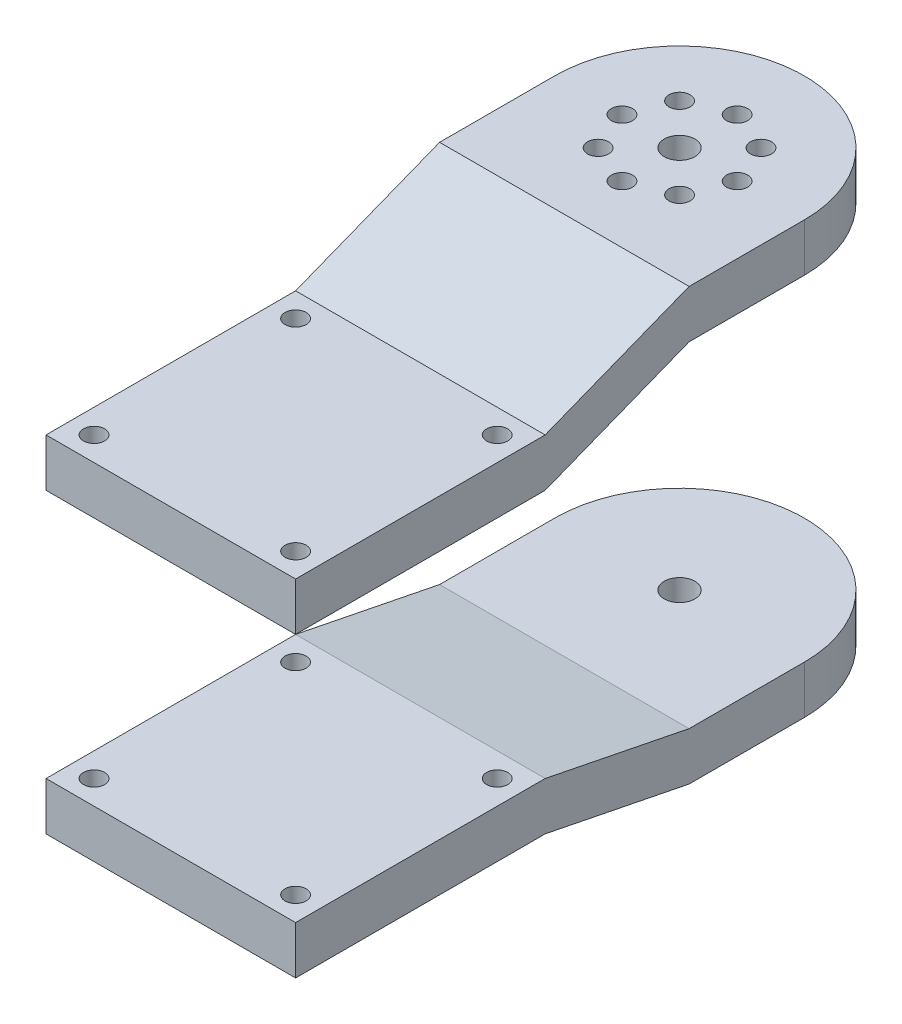
ISO-10303-21;
HEADER;
FILE_DESCRIPTION(('STEP AP214'),'2;1');
FILE_NAME('part.step','',(''),(''),'','','');
FILE_SCHEMA(('AUTOMOTIVE_DESIGN { 1 0 10303 214 1 1 1 1 }'));
ENDSEC;
DATA;
#1=APPLICATION_CONTEXT('core data for automotive mechanical design processes');
#2=APPLICATION_PROTOCOL_DEFINITION('international standard','automotive_design',2000,#1);
#3=PRODUCT_CONTEXT('',#1,'mechanical');
#4=PRODUCT('Part','Part','',(#3));
#5=PRODUCT_RELATED_PRODUCT_CATEGORY('part','',(#4));
#6=PRODUCT_DEFINITION_FORMATION('','',#4);
#7=PRODUCT_DEFINITION_CONTEXT('part definition',#1,'design');
#8=PRODUCT_DEFINITION('design','',#6,#7);
#9=PRODUCT_DEFINITION_SHAPE('','',#8);
#10=(LENGTH_UNIT() NAMED_UNIT(*) SI_UNIT(.MILLI.,.METRE.));
#11=(NAMED_UNIT(*) PLANE_ANGLE_UNIT() SI_UNIT($,.RADIAN.));
#12=(NAMED_UNIT(*) SI_UNIT($,.STERADIAN.) SOLID_ANGLE_UNIT());
#13=UNCERTAINTY_MEASURE_WITH_UNIT(LENGTH_MEASURE(1.E-05),#10,'distance_accuracy_value','');
#14=(GEOMETRIC_REPRESENTATION_CONTEXT(3) GLOBAL_UNCERTAINTY_ASSIGNED_CONTEXT((#13)) GLOBAL_UNIT_ASSIGNED_CONTEXT((#10,
#11,#12)) REPRESENTATION_CONTEXT('',''));
#15=CARTESIAN_POINT('',(0.,0.,0.));
#16=DIRECTION('',(0.,0.,1.));
#17=DIRECTION('',(1.,0.,0.));
#18=AXIS2_PLACEMENT_3D('',#15,#16,#17);
#19=CARTESIAN_POINT('',(0.,-39.9,-40.));
#20=DIRECTION('',(0.,1.,0.));
#21=DIRECTION('',(0.,0.,1.));
#22=AXIS2_PLACEMENT_3D('',#19,#20,#21);
#23=CYLINDRICAL_SURFACE('',#22,13.);
#24=CARTESIAN_POINT('',(0.,-34.9,-40.));
#25=DIRECTION('',(0.,1.,0.));
#26=DIRECTION('',(0.,0.,1.));
#27=AXIS2_PLACEMENT_3D('',#24,#25,#26);
#28=CIRCLE('',#27,13.);
#29=CARTESIAN_POINT('',(13.,-34.9,-40.));
#30=VERTEX_POINT('',#29);
#31=CARTESIAN_POINT('',(-13.,-34.9,-40.));
#32=VERTEX_POINT('',#31);
#33=EDGE_CURVE('E87',#30,#32,#28,.T.);
#34=ORIENTED_EDGE('',*,*,#33,.F.);
#35=DIRECTION('',(0.,1.,0.));
#36=VECTOR('',#35,1.);
#37=CARTESIAN_POINT('',(13.,-39.9,-40.));
#38=LINE('',#37,#36);
#39=CARTESIAN_POINT('',(13.,-39.9,-40.));
#40=VERTEX_POINT('',#39);
#41=EDGE_CURVE('E12',#40,#30,#38,.T.);
#42=ORIENTED_EDGE('',*,*,#41,.F.);
#43=CARTESIAN_POINT('',(0.,-39.9,-40.));
#44=DIRECTION('',(0.,1.,0.));
#45=DIRECTION('',(0.,0.,1.));
#46=AXIS2_PLACEMENT_3D('',#43,#44,#45);
#47=CIRCLE('',#46,13.);
#48=CARTESIAN_POINT('',(-13.,-39.9,-40.));
#49=VERTEX_POINT('',#48);
#50=EDGE_CURVE('E92',#40,#49,#47,.T.);
#51=ORIENTED_EDGE('',*,*,#50,.T.);
#52=DIRECTION('',(0.,1.,0.));
#53=VECTOR('',#52,1.);
#54=CARTESIAN_POINT('',(-13.,-39.9,-40.));
#55=LINE('',#54,#53);
#56=EDGE_CURVE('E100',#49,#32,#55,.T.);
#57=ORIENTED_EDGE('',*,*,#56,.T.);
#58=EDGE_LOOP('',(#34,#42,#51,#57));
#59=FACE_BOUND('',#58,.T.);
#60=ADVANCED_FACE('F43',(#59),#23,.T.);
#61=CARTESIAN_POINT('',(13.,-39.9,13.));
#62=DIRECTION('',(1.,0.,0.));
#63=DIRECTION('',(0.,0.,-1.));
#64=AXIS2_PLACEMENT_3D('',#61,#62,#63);
#65=PLANE('',#64);
#66=DIRECTION('',(0.,0.,1.));
#67=VECTOR('',#66,1.);
#68=CARTESIAN_POINT('',(13.,-36.9,13.));
#69=LINE('',#68,#67);
#70=CARTESIAN_POINT('',(13.,-36.9,-13.));
#71=VERTEX_POINT('',#70);
#72=CARTESIAN_POINT('',(13.,-36.9,13.));
#73=VERTEX_POINT('',#72);
#74=EDGE_CURVE('E174',#71,#73,#69,.T.);
#75=ORIENTED_EDGE('',*,*,#74,.F.);
#76=DIRECTION('',(0.,0.196116135138184,0.98058067569092));
#77=VECTOR('',#76,1.);
#78=CARTESIAN_POINT('',(13.,-36.9,-13.));
#79=LINE('',#78,#77);
#80=CARTESIAN_POINT('',(13.,-39.9,-28.));
#81=VERTEX_POINT('',#80);
#82=EDGE_CURVE('E170',#81,#71,#79,.T.);
#83=ORIENTED_EDGE('',*,*,#82,.F.);
#84=DIRECTION('',(0.,0.,-1.));
#85=VECTOR('',#84,1.);
#86=CARTESIAN_POINT('',(13.,-39.9,13.));
#87=LINE('',#86,#85);
#88=EDGE_CURVE('E67',#81,#40,#87,.T.);
#89=ORIENTED_EDGE('',*,*,#88,.T.);
#90=ORIENTED_EDGE('',*,*,#41,.T.);
#91=DIRECTION('',(0.,0.,-1.));
#92=VECTOR('',#91,1.);
#93=CARTESIAN_POINT('',(13.,-34.9,13.));
#94=LINE('',#93,#92);
#95=CARTESIAN_POINT('',(13.,-34.9,-28.));
#96=VERTEX_POINT('',#95);
#97=EDGE_CURVE('E82',#96,#30,#94,.T.);
#98=ORIENTED_EDGE('',*,*,#97,.F.);
#99=DIRECTION('',(0.,0.196116135138184,0.98058067569092));
#100=VECTOR('',#99,1.);
#101=CARTESIAN_POINT('',(13.,-34.9,-28.));
#102=LINE('',#101,#100);
#103=CARTESIAN_POINT('',(13.,-31.9,-13.));
#104=VERTEX_POINT('',#103);
#105=EDGE_CURVE('E149',#96,#104,#102,.T.);
#106=ORIENTED_EDGE('',*,*,#105,.T.);
#107=DIRECTION('',(0.,0.,-1.));
#108=VECTOR('',#107,1.);
#109=CARTESIAN_POINT('',(13.,-31.9,13.));
#110=LINE('',#109,#108);
#111=CARTESIAN_POINT('',(13.,-31.9,13.));
#112=VERTEX_POINT('',#111);
#113=EDGE_CURVE('E126',#112,#104,#110,.T.);
#114=ORIENTED_EDGE('',*,*,#113,.F.);
#115=DIRECTION('',(0.,1.,0.));
#116=VECTOR('',#115,1.);
#117=CARTESIAN_POINT('',(13.,-39.9,13.));
#118=LINE('',#117,#116);
#119=EDGE_CURVE('E51',#73,#112,#118,.T.);
#120=ORIENTED_EDGE('',*,*,#119,.F.);
#121=EDGE_LOOP('',(#75,#83,#89,#90,#98,#106,#114,#120));
#122=FACE_BOUND('',#121,.T.);
#123=ADVANCED_FACE('F96',(#122),#65,.T.);
#124=CARTESIAN_POINT('',(-13.,-39.9,13.));
#125=DIRECTION('',(0.,0.,1.));
#126=DIRECTION('',(1.,0.,0.));
#127=AXIS2_PLACEMENT_3D('',#124,#125,#126);
#128=PLANE('',#127);
#129=DIRECTION('',(1.,0.,0.));
#130=VECTOR('',#129,1.);
#131=CARTESIAN_POINT('',(-13.,-36.9,13.));
#132=LINE('',#131,#130);
#133=CARTESIAN_POINT('',(-13.,-36.9,13.));
#134=VERTEX_POINT('',#133);
#135=EDGE_CURVE('E162',#134,#73,#132,.T.);
#136=ORIENTED_EDGE('',*,*,#135,.T.);
#137=ORIENTED_EDGE('',*,*,#119,.T.);
#138=DIRECTION('',(1.,0.,0.));
#139=VECTOR('',#138,1.);
#140=CARTESIAN_POINT('',(-13.,-31.9,13.));
#141=LINE('',#140,#139);
#142=CARTESIAN_POINT('',(-13.,-31.9,13.));
#143=VERTEX_POINT('',#142);
#144=EDGE_CURVE('E129',#143,#112,#141,.T.);
#145=ORIENTED_EDGE('',*,*,#144,.F.);
#146=DIRECTION('',(0.,1.,0.));
#147=VECTOR('',#146,1.);
#148=CARTESIAN_POINT('',(-13.,-39.9,13.));
#149=LINE('',#148,#147);
#150=EDGE_CURVE('E113',#134,#143,#149,.T.);
#151=ORIENTED_EDGE('',*,*,#150,.F.);
#152=EDGE_LOOP('',(#136,#137,#145,#151));
#153=FACE_BOUND('',#152,.T.);
#154=ADVANCED_FACE('F192',(#153),#128,.T.);
#155=CARTESIAN_POINT('',(-13.,-39.9,-40.));
#156=DIRECTION('',(-1.,0.,0.));
#157=DIRECTION('',(0.,0.,1.));
#158=AXIS2_PLACEMENT_3D('',#155,#156,#157);
#159=PLANE('',#158);
#160=DIRECTION('',(0.,0.,1.));
#161=VECTOR('',#160,1.);
#162=CARTESIAN_POINT('',(-13.,-36.9,13.));
#163=LINE('',#162,#161);
#164=CARTESIAN_POINT('',(-13.,-36.9,-13.));
#165=VERTEX_POINT('',#164);
#166=EDGE_CURVE('E173',#165,#134,#163,.T.);
#167=ORIENTED_EDGE('',*,*,#166,.T.);
#168=ORIENTED_EDGE('',*,*,#150,.T.);
#169=DIRECTION('',(0.,0.,1.));
#170=VECTOR('',#169,1.);
#171=CARTESIAN_POINT('',(-13.,-31.9,13.));
#172=LINE('',#171,#170);
#173=CARTESIAN_POINT('',(-13.,-31.9,-13.));
#174=VERTEX_POINT('',#173);
#175=EDGE_CURVE('E132',#174,#143,#172,.T.);
#176=ORIENTED_EDGE('',*,*,#175,.F.);
#177=DIRECTION('',(0.,-0.196116135138184,-0.98058067569092));
#178=VECTOR('',#177,1.);
#179=CARTESIAN_POINT('',(-13.,-34.9,-28.));
#180=LINE('',#179,#178);
#181=CARTESIAN_POINT('',(-13.,-34.9,-28.));
#182=VERTEX_POINT('',#181);
#183=EDGE_CURVE('E147',#174,#182,#180,.T.);
#184=ORIENTED_EDGE('',*,*,#183,.T.);
#185=DIRECTION('',(0.,0.,1.));
#186=VECTOR('',#185,1.);
#187=CARTESIAN_POINT('',(-13.,-34.9,-40.));
#188=LINE('',#187,#186);
#189=EDGE_CURVE('E93',#32,#182,#188,.T.);
#190=ORIENTED_EDGE('',*,*,#189,.F.);
#191=ORIENTED_EDGE('',*,*,#56,.F.);
#192=DIRECTION('',(0.,0.,1.));
#193=VECTOR('',#192,1.);
#194=CARTESIAN_POINT('',(-13.,-39.9,-40.));
#195=LINE('',#194,#193);
#196=CARTESIAN_POINT('',(-13.,-39.9,-28.));
#197=VERTEX_POINT('',#196);
#198=EDGE_CURVE('E115',#49,#197,#195,.T.);
#199=ORIENTED_EDGE('',*,*,#198,.T.);
#200=DIRECTION('',(0.,0.196116135138184,0.98058067569092));
#201=VECTOR('',#200,1.);
#202=CARTESIAN_POINT('',(-13.,-36.9,-13.));
#203=LINE('',#202,#201);
#204=EDGE_CURVE('E59',#197,#165,#203,.T.);
#205=ORIENTED_EDGE('',*,*,#204,.T.);
#206=EDGE_LOOP('',(#167,#168,#176,#184,#190,#191,#199,#205));
#207=FACE_BOUND('',#206,.T.);
#208=ADVANCED_FACE('F182',(#207),#159,.T.);
#209=CARTESIAN_POINT('',(0.,-39.9,-40.));
#210=DIRECTION('',(0.,1.,0.));
#211=DIRECTION('',(0.,0.,1.));
#212=AXIS2_PLACEMENT_3D('',#209,#210,#211);
#213=PLANE('',#212);
#214=CARTESIAN_POINT('',(0.,-39.9,-40.));
#215=DIRECTION('',(0.,1.,0.));
#216=DIRECTION('',(0.,0.,1.));
#217=AXIS2_PLACEMENT_3D('',#214,#215,#216);
#218=CIRCLE('',#217,1.6);
#219=CARTESIAN_POINT('',(0.,-39.9,-38.4));
#220=VERTEX_POINT('',#219);
#221=EDGE_CURVE('E102',#220,#220,#218,.T.);
#222=ORIENTED_EDGE('',*,*,#221,.T.);
#223=EDGE_LOOP('',(#222));
#224=FACE_BOUND('',#223,.T.);
#225=ORIENTED_EDGE('',*,*,#88,.F.);
#226=DIRECTION('',(1.,0.,0.));
#227=VECTOR('',#226,1.);
#228=CARTESIAN_POINT('',(-13.,-39.9,-28.));
#229=LINE('',#228,#227);
#230=EDGE_CURVE('E165',#197,#81,#229,.T.);
#231=ORIENTED_EDGE('',*,*,#230,.F.);
#232=ORIENTED_EDGE('',*,*,#198,.F.);
#233=ORIENTED_EDGE('',*,*,#50,.F.);
#234=EDGE_LOOP('',(#225,#231,#232,#233));
#235=FACE_BOUND('',#234,.T.);
#236=ADVANCED_FACE('F221',(#224,#235),#213,.F.);
#237=CARTESIAN_POINT('',(0.,-34.9,-40.));
#238=DIRECTION('',(0.,1.,0.));
#239=DIRECTION('',(0.,0.,1.));
#240=AXIS2_PLACEMENT_3D('',#237,#238,#239);
#241=PLANE('',#240);
#242=DIRECTION('',(1.,0.,0.));
#243=VECTOR('',#242,1.);
#244=CARTESIAN_POINT('',(-29.1186227699515,-34.9,-28.));
#245=LINE('',#244,#243);
#246=EDGE_CURVE('E90',#182,#96,#245,.T.);
#247=ORIENTED_EDGE('',*,*,#246,.T.);
#248=ORIENTED_EDGE('',*,*,#97,.T.);
#249=ORIENTED_EDGE('',*,*,#33,.T.);
#250=ORIENTED_EDGE('',*,*,#189,.T.);
#251=EDGE_LOOP('',(#247,#248,#249,#250));
#252=FACE_BOUND('',#251,.T.);
#253=CARTESIAN_POINT('',(0.,-34.9,-40.));
#254=DIRECTION('',(0.,1.,0.));
#255=DIRECTION('',(0.,0.,1.));
#256=AXIS2_PLACEMENT_3D('',#253,#254,#255);
#257=CIRCLE('',#256,1.6);
#258=CARTESIAN_POINT('',(0.,-34.9,-38.4));
#259=VERTEX_POINT('',#258);
#260=EDGE_CURVE('E106',#259,#259,#257,.T.);
#261=ORIENTED_EDGE('',*,*,#260,.F.);
#262=EDGE_LOOP('',(#261));
#263=FACE_BOUND('',#262,.T.);
#264=ADVANCED_FACE('F83',(#252,#263),#241,.T.);
#265=CARTESIAN_POINT('',(0.,-39.9,-40.));
#266=DIRECTION('',(0.,1.,0.));
#267=DIRECTION('',(0.,0.,1.));
#268=AXIS2_PLACEMENT_3D('',#265,#266,#267);
#269=CYLINDRICAL_SURFACE('',#268,1.6);
#270=ORIENTED_EDGE('',*,*,#221,.F.);
#271=EDGE_LOOP('',(#270));
#272=FACE_BOUND('',#271,.T.);
#273=ORIENTED_EDGE('',*,*,#260,.T.);
#274=EDGE_LOOP('',(#273));
#275=FACE_BOUND('',#274,.T.);
#276=ADVANCED_FACE('F229',(#272,#275),#269,.F.);
#277=CARTESIAN_POINT('',(10.5,-39.9,10.5));
#278=DIRECTION('',(0.,1.,0.));
#279=DIRECTION('',(0.,0.,1.));
#280=AXIS2_PLACEMENT_3D('',#277,#278,#279);
#281=CYLINDRICAL_SURFACE('',#280,1.1);
#282=CARTESIAN_POINT('',(10.5,-36.9,10.5));
#283=DIRECTION('',(0.,1.,0.));
#284=DIRECTION('',(0.,0.,1.));
#285=AXIS2_PLACEMENT_3D('',#282,#283,#284);
#286=CIRCLE('',#285,1.1);
#287=CARTESIAN_POINT('',(10.5,-36.9,11.6));
#288=VERTEX_POINT('',#287);
#289=EDGE_CURVE('E151',#288,#288,#286,.F.);
#290=ORIENTED_EDGE('',*,*,#289,.T.);
#291=EDGE_LOOP('',(#290));
#292=FACE_BOUND('',#291,.T.);
#293=CARTESIAN_POINT('',(10.5,-31.9,10.5));
#294=DIRECTION('',(0.,1.,0.));
#295=DIRECTION('',(0.,0.,1.));
#296=AXIS2_PLACEMENT_3D('',#293,#294,#295);
#297=CIRCLE('',#296,1.1);
#298=CARTESIAN_POINT('',(10.5,-31.9,11.6));
#299=VERTEX_POINT('',#298);
#300=EDGE_CURVE('E135',#299,#299,#297,.T.);
#301=ORIENTED_EDGE('',*,*,#300,.T.);
#302=EDGE_LOOP('',(#301));
#303=FACE_BOUND('',#302,.T.);
#304=ADVANCED_FACE('F261',(#292,#303),#281,.F.);
#305=CARTESIAN_POINT('',(-10.5,-39.9,10.5));
#306=DIRECTION('',(0.,1.,0.));
#307=DIRECTION('',(0.,0.,1.));
#308=AXIS2_PLACEMENT_3D('',#305,#306,#307);
#309=CYLINDRICAL_SURFACE('',#308,1.1);
#310=CARTESIAN_POINT('',(-10.5,-36.9,10.5));
#311=DIRECTION('',(0.,1.,0.));
#312=DIRECTION('',(0.,0.,1.));
#313=AXIS2_PLACEMENT_3D('',#310,#311,#312);
#314=CIRCLE('',#313,1.1);
#315=CARTESIAN_POINT('',(-10.5,-36.9,11.6));
#316=VERTEX_POINT('',#315);
#317=EDGE_CURVE('E156',#316,#316,#314,.F.);
#318=ORIENTED_EDGE('',*,*,#317,.T.);
#319=EDGE_LOOP('',(#318));
#320=FACE_BOUND('',#319,.T.);
#321=CARTESIAN_POINT('',(-10.5,-31.9,10.5));
#322=DIRECTION('',(0.,1.,0.));
#323=DIRECTION('',(0.,0.,1.));
#324=AXIS2_PLACEMENT_3D('',#321,#322,#323);
#325=CIRCLE('',#324,1.1);
#326=CARTESIAN_POINT('',(-10.5,-31.9,11.6));
#327=VERTEX_POINT('',#326);
#328=EDGE_CURVE('E138',#327,#327,#325,.T.);
#329=ORIENTED_EDGE('',*,*,#328,.T.);
#330=EDGE_LOOP('',(#329));
#331=FACE_BOUND('',#330,.T.);
#332=ADVANCED_FACE('F266',(#320,#331),#309,.F.);
#333=CARTESIAN_POINT('',(-10.5,-39.9,-10.5));
#334=DIRECTION('',(0.,1.,0.));
#335=DIRECTION('',(0.,0.,1.));
#336=AXIS2_PLACEMENT_3D('',#333,#334,#335);
#337=CYLINDRICAL_SURFACE('',#336,1.1);
#338=CARTESIAN_POINT('',(-10.5,-36.9,-10.5));
#339=DIRECTION('',(0.,1.,0.));
#340=DIRECTION('',(0.,0.,1.));
#341=AXIS2_PLACEMENT_3D('',#338,#339,#340);
#342=CIRCLE('',#341,1.1);
#343=CARTESIAN_POINT('',(-10.5,-36.9,-9.4));
#344=VERTEX_POINT('',#343);
#345=EDGE_CURVE('E159',#344,#344,#342,.F.);
#346=ORIENTED_EDGE('',*,*,#345,.T.);
#347=EDGE_LOOP('',(#346));
#348=FACE_BOUND('',#347,.T.);
#349=CARTESIAN_POINT('',(-10.5,-31.9,-10.5));
#350=DIRECTION('',(0.,1.,0.));
#351=DIRECTION('',(0.,0.,1.));
#352=AXIS2_PLACEMENT_3D('',#349,#350,#351);
#353=CIRCLE('',#352,1.1);
#354=CARTESIAN_POINT('',(-10.5,-31.9,-9.4));
#355=VERTEX_POINT('',#354);
#356=EDGE_CURVE('E141',#355,#355,#353,.T.);
#357=ORIENTED_EDGE('',*,*,#356,.T.);
#358=EDGE_LOOP('',(#357));
#359=FACE_BOUND('',#358,.T.);
#360=ADVANCED_FACE('F278',(#348,#359),#337,.F.);
#361=CARTESIAN_POINT('',(10.5,-39.9,-10.5));
#362=DIRECTION('',(0.,1.,0.));
#363=DIRECTION('',(0.,0.,1.));
#364=AXIS2_PLACEMENT_3D('',#361,#362,#363);
#365=CYLINDRICAL_SURFACE('',#364,1.1);
#366=CARTESIAN_POINT('',(10.5,-36.9,-10.5));
#367=DIRECTION('',(0.,1.,0.));
#368=DIRECTION('',(0.,0.,1.));
#369=AXIS2_PLACEMENT_3D('',#366,#367,#368);
#370=CIRCLE('',#369,1.1);
#371=CARTESIAN_POINT('',(10.5,-36.9,-9.4));
#372=VERTEX_POINT('',#371);
#373=EDGE_CURVE('E46',#372,#372,#370,.F.);
#374=ORIENTED_EDGE('',*,*,#373,.T.);
#375=EDGE_LOOP('',(#374));
#376=FACE_BOUND('',#375,.T.);
#377=CARTESIAN_POINT('',(10.5,-31.9,-10.5));
#378=DIRECTION('',(0.,1.,0.));
#379=DIRECTION('',(0.,0.,1.));
#380=AXIS2_PLACEMENT_3D('',#377,#378,#379);
#381=CIRCLE('',#380,1.1);
#382=CARTESIAN_POINT('',(10.5,-31.9,-9.4));
#383=VERTEX_POINT('',#382);
#384=EDGE_CURVE('E144',#383,#383,#381,.T.);
#385=ORIENTED_EDGE('',*,*,#384,.T.);
#386=EDGE_LOOP('',(#385));
#387=FACE_BOUND('',#386,.T.);
#388=ADVANCED_FACE('F289',(#376,#387),#365,.F.);
#389=CARTESIAN_POINT('',(0.,-31.9,0.));
#390=DIRECTION('',(0.,-1.,0.));
#391=DIRECTION('',(0.,0.,-1.));
#392=AXIS2_PLACEMENT_3D('',#389,#390,#391);
#393=PLANE('',#392);
#394=ORIENTED_EDGE('',*,*,#175,.T.);
#395=ORIENTED_EDGE('',*,*,#144,.T.);
#396=ORIENTED_EDGE('',*,*,#113,.T.);
#397=DIRECTION('',(-1.,0.,0.));
#398=VECTOR('',#397,1.);
#399=CARTESIAN_POINT('',(-13.,-31.9,-13.));
#400=LINE('',#399,#398);
#401=EDGE_CURVE('E122',#104,#174,#400,.T.);
#402=ORIENTED_EDGE('',*,*,#401,.T.);
#403=EDGE_LOOP('',(#394,#395,#396,#402));
#404=FACE_BOUND('',#403,.T.);
#405=ORIENTED_EDGE('',*,*,#300,.F.);
#406=EDGE_LOOP('',(#405));
#407=FACE_BOUND('',#406,.T.);
#408=ORIENTED_EDGE('',*,*,#328,.F.);
#409=EDGE_LOOP('',(#408));
#410=FACE_BOUND('',#409,.T.);
#411=ORIENTED_EDGE('',*,*,#356,.F.);
#412=EDGE_LOOP('',(#411));
#413=FACE_BOUND('',#412,.T.);
#414=ORIENTED_EDGE('',*,*,#384,.F.);
#415=EDGE_LOOP('',(#414));
#416=FACE_BOUND('',#415,.T.);
#417=ADVANCED_FACE('F199',(#404,#407,#410,#413,#416),#393,.F.);
#418=CARTESIAN_POINT('',(-29.1186227699515,-34.9,-28.));
#419=DIRECTION('',(0.,0.98058067569092,-0.196116135138184));
#420=DIRECTION('',(0.,0.196116135138184,0.98058067569092));
#421=AXIS2_PLACEMENT_3D('',#418,#419,#420);
#422=PLANE('',#421);
#423=ORIENTED_EDGE('',*,*,#183,.F.);
#424=ORIENTED_EDGE('',*,*,#401,.F.);
#425=ORIENTED_EDGE('',*,*,#105,.F.);
#426=ORIENTED_EDGE('',*,*,#246,.F.);
#427=EDGE_LOOP('',(#423,#424,#425,#426));
#428=FACE_BOUND('',#427,.T.);
#429=ADVANCED_FACE('F219',(#428),#422,.T.);
#430=CARTESIAN_POINT('',(-13.,-36.9,13.));
#431=DIRECTION('',(0.,1.,0.));
#432=DIRECTION('',(0.,0.,1.));
#433=AXIS2_PLACEMENT_3D('',#430,#431,#432);
#434=PLANE('',#433);
#435=ORIENTED_EDGE('',*,*,#317,.F.);
#436=EDGE_LOOP('',(#435));
#437=FACE_BOUND('',#436,.T.);
#438=ORIENTED_EDGE('',*,*,#373,.F.);
#439=EDGE_LOOP('',(#438));
#440=FACE_BOUND('',#439,.T.);
#441=ORIENTED_EDGE('',*,*,#74,.T.);
#442=ORIENTED_EDGE('',*,*,#135,.F.);
#443=ORIENTED_EDGE('',*,*,#166,.F.);
#444=DIRECTION('',(1.,0.,0.));
#445=VECTOR('',#444,1.);
#446=CARTESIAN_POINT('',(-13.,-36.9,-13.));
#447=LINE('',#446,#445);
#448=EDGE_CURVE('E167',#165,#71,#447,.T.);
#449=ORIENTED_EDGE('',*,*,#448,.T.);
#450=EDGE_LOOP('',(#441,#442,#443,#449));
#451=FACE_BOUND('',#450,.T.);
#452=ORIENTED_EDGE('',*,*,#345,.F.);
#453=EDGE_LOOP('',(#452));
#454=FACE_BOUND('',#453,.T.);
#455=ORIENTED_EDGE('',*,*,#289,.F.);
#456=EDGE_LOOP('',(#455));
#457=FACE_BOUND('',#456,.T.);
#458=ADVANCED_FACE('F217',(#437,#440,#451,#454,#457),#434,.F.);
#459=CARTESIAN_POINT('',(-13.,-36.9,-13.));
#460=DIRECTION('',(0.,0.98058067569092,-0.196116135138184));
#461=DIRECTION('',(0.,0.196116135138184,0.98058067569092));
#462=AXIS2_PLACEMENT_3D('',#459,#460,#461);
#463=PLANE('',#462);
#464=ORIENTED_EDGE('',*,*,#82,.T.);
#465=ORIENTED_EDGE('',*,*,#448,.F.);
#466=ORIENTED_EDGE('',*,*,#204,.F.);
#467=ORIENTED_EDGE('',*,*,#230,.T.);
#468=EDGE_LOOP('',(#464,#465,#466,#467));
#469=FACE_BOUND('',#468,.T.);
#470=ADVANCED_FACE('F216',(#469),#463,.F.);
#471=CLOSED_SHELL('',(#60,#123,#154,#208,#236,#264,#276,#304,#332,#360,#388,#417,#429,#458,#470));
#472=MANIFOLD_SOLID_BREP('B2',#471);
#473=CARTESIAN_POINT('',(0.,5.,-40.));
#474=DIRECTION('',(0.,1.,0.));
#475=DIRECTION('',(0.,0.,1.));
#476=AXIS2_PLACEMENT_3D('',#473,#474,#475);
#477=PLANE('',#476);
#478=DIRECTION('',(1.,0.,0.));
#479=VECTOR('',#478,1.);
#480=CARTESIAN_POINT('',(-13.,5.,-28.));
#481=LINE('',#480,#479);
#482=CARTESIAN_POINT('',(-13.,5.,-28.));
#483=VERTEX_POINT('',#482);
#484=CARTESIAN_POINT('',(13.,5.,-28.));
#485=VERTEX_POINT('',#484);
#486=EDGE_CURVE('E601',#483,#485,#481,.T.);
#487=ORIENTED_EDGE('',*,*,#486,.T.);
#488=DIRECTION('',(0.,0.,-1.));
#489=VECTOR('',#488,1.);
#490=CARTESIAN_POINT('',(13.,5.,13.));
#491=LINE('',#490,#489);
#492=CARTESIAN_POINT('',(13.,5.,-40.));
#493=VERTEX_POINT('',#492);
#494=EDGE_CURVE('E495',#485,#493,#491,.T.);
#495=ORIENTED_EDGE('',*,*,#494,.T.);
#496=CARTESIAN_POINT('',(0.,5.,-40.));
#497=DIRECTION('',(0.,1.,0.));
#498=DIRECTION('',(0.,0.,1.));
#499=AXIS2_PLACEMENT_3D('',#496,#497,#498);
#500=CIRCLE('',#499,13.);
#501=CARTESIAN_POINT('',(-13.,5.,-40.));
#502=VERTEX_POINT('',#501);
#503=EDGE_CURVE('E498',#493,#502,#500,.T.);
#504=ORIENTED_EDGE('',*,*,#503,.T.);
#505=DIRECTION('',(0.,0.,1.));
#506=VECTOR('',#505,1.);
#507=CARTESIAN_POINT('',(-13.,5.,-40.));
#508=LINE('',#507,#506);
#509=EDGE_CURVE('E506',#502,#483,#508,.T.);
#510=ORIENTED_EDGE('',*,*,#509,.T.);
#511=EDGE_LOOP('',(#487,#495,#504,#510));
#512=FACE_BOUND('',#511,.T.);
#513=CARTESIAN_POINT('',(-6.,5.,-40.));
#514=DIRECTION('',(0.,1.,0.));
#515=DIRECTION('',(0.,0.,1.));
#516=AXIS2_PLACEMENT_3D('',#513,#514,#515);
#517=CIRCLE('',#516,1.09999999999999);
#518=CARTESIAN_POINT('',(-6.,5.,-38.9));
#519=VERTEX_POINT('',#518);
#520=EDGE_CURVE('E550',#519,#519,#517,.T.);
#521=ORIENTED_EDGE('',*,*,#520,.F.);
#522=EDGE_LOOP('',(#521));
#523=FACE_BOUND('',#522,.T.);
#524=CARTESIAN_POINT('',(0.,5.,-34.));
#525=DIRECTION('',(0.,1.,0.));
#526=DIRECTION('',(0.,0.,1.));
#527=AXIS2_PLACEMENT_3D('',#524,#525,#526);
#528=CIRCLE('',#527,1.1);
#529=CARTESIAN_POINT('',(0.,5.,-32.9));
#530=VERTEX_POINT('',#529);
#531=EDGE_CURVE('E538',#530,#530,#528,.T.);
#532=ORIENTED_EDGE('',*,*,#531,.F.);
#533=EDGE_LOOP('',(#532));
#534=FACE_BOUND('',#533,.T.);
#535=CARTESIAN_POINT('',(6.00000000000001,5.,-40.));
#536=DIRECTION('',(0.,1.,0.));
#537=DIRECTION('',(0.,0.,1.));
#538=AXIS2_PLACEMENT_3D('',#535,#536,#537);
#539=CIRCLE('',#538,1.10000000000001);
#540=CARTESIAN_POINT('',(6.00000000000001,5.,-38.9));
#541=VERTEX_POINT('',#540);
#542=EDGE_CURVE('E526',#541,#541,#539,.T.);
#543=ORIENTED_EDGE('',*,*,#542,.F.);
#544=EDGE_LOOP('',(#543));
#545=FACE_BOUND('',#544,.T.);
#546=CARTESIAN_POINT('',(0.,5.,-40.));
#547=DIRECTION('',(0.,1.,0.));
#548=DIRECTION('',(0.,0.,1.));
#549=AXIS2_PLACEMENT_3D('',#546,#547,#548);
#550=CIRCLE('',#549,1.6);
#551=CARTESIAN_POINT('',(0.,5.,-38.4));
#552=VERTEX_POINT('',#551);
#553=EDGE_CURVE('E514',#552,#552,#550,.T.);
#554=ORIENTED_EDGE('',*,*,#553,.F.);
#555=EDGE_LOOP('',(#554));
#556=FACE_BOUND('',#555,.T.);
#557=CARTESIAN_POINT('',(0.,5.,-46.));
#558=DIRECTION('',(0.,1.,0.));
#559=DIRECTION('',(0.,0.,1.));
#560=AXIS2_PLACEMENT_3D('',#557,#558,#559);
#561=CIRCLE('',#560,1.09999999999999);
#562=CARTESIAN_POINT('',(0.,5.,-44.9));
#563=VERTEX_POINT('',#562);
#564=EDGE_CURVE('E504',#563,#563,#561,.T.);
#565=ORIENTED_EDGE('',*,*,#564,.F.);
#566=EDGE_LOOP('',(#565));
#567=FACE_BOUND('',#566,.T.);
#568=CARTESIAN_POINT('',(4.24264068711928,5.,-44.2426406871193));
#569=DIRECTION('',(0.,1.,0.));
#570=DIRECTION('',(0.,0.,1.));
#571=AXIS2_PLACEMENT_3D('',#568,#569,#570);
#572=CIRCLE('',#571,1.10000000000001);
#573=CARTESIAN_POINT('',(4.24264068711928,5.,-43.1426406871193));
#574=VERTEX_POINT('',#573);
#575=EDGE_CURVE('E520',#574,#574,#572,.T.);
#576=ORIENTED_EDGE('',*,*,#575,.F.);
#577=EDGE_LOOP('',(#576));
#578=FACE_BOUND('',#577,.T.);
#579=CARTESIAN_POINT('',(4.24264068711928,5.,-35.7573593128807));
#580=DIRECTION('',(0.,1.,0.));
#581=DIRECTION('',(0.,0.,1.));
#582=AXIS2_PLACEMENT_3D('',#579,#580,#581);
#583=CIRCLE('',#582,1.10000000000001);
#584=CARTESIAN_POINT('',(4.24264068711928,5.,-34.6573593128807));
#585=VERTEX_POINT('',#584);
#586=EDGE_CURVE('E532',#585,#585,#583,.T.);
#587=ORIENTED_EDGE('',*,*,#586,.F.);
#588=EDGE_LOOP('',(#587));
#589=FACE_BOUND('',#588,.T.);
#590=CARTESIAN_POINT('',(-4.24264068711929,5.,-35.7573593128807));
#591=DIRECTION('',(0.,1.,0.));
#592=DIRECTION('',(0.,0.,1.));
#593=AXIS2_PLACEMENT_3D('',#590,#591,#592);
#594=CIRCLE('',#593,1.10000000000001);
#595=CARTESIAN_POINT('',(-4.24264068711929,5.,-34.6573593128807));
#596=VERTEX_POINT('',#595);
#597=EDGE_CURVE('E544',#596,#596,#594,.T.);
#598=ORIENTED_EDGE('',*,*,#597,.F.);
#599=EDGE_LOOP('',(#598));
#600=FACE_BOUND('',#599,.T.);
#601=CARTESIAN_POINT('',(-4.24264068711928,5.,-44.2426406871193));
#602=DIRECTION('',(0.,1.,0.));
#603=DIRECTION('',(0.,0.,1.));
#604=AXIS2_PLACEMENT_3D('',#601,#602,#603);
#605=CIRCLE('',#604,1.09999999999999);
#606=CARTESIAN_POINT('',(-4.24264068711928,5.,-43.1426406871193));
#607=VERTEX_POINT('',#606);
#608=EDGE_CURVE('E556',#607,#607,#605,.T.);
#609=ORIENTED_EDGE('',*,*,#608,.F.);
#610=EDGE_LOOP('',(#609));
#611=FACE_BOUND('',#610,.T.);
#612=ADVANCED_FACE('F403',(#512,#523,#534,#545,#556,#567,#578,#589,#600,#611),#477,.T.);
#613=CARTESIAN_POINT('',(0.,0.,-40.));
#614=DIRECTION('',(0.,1.,0.));
#615=DIRECTION('',(0.,0.,1.));
#616=AXIS2_PLACEMENT_3D('',#613,#614,#615);
#617=PLANE('',#616);
#618=DIRECTION('',(0.,0.,-1.));
#619=VECTOR('',#618,1.);
#620=CARTESIAN_POINT('',(13.,0.,13.));
#621=LINE('',#620,#619);
#622=CARTESIAN_POINT('',(13.,0.,-28.));
#623=VERTEX_POINT('',#622);
#624=CARTESIAN_POINT('',(13.,0.,-40.));
#625=VERTEX_POINT('',#624);
#626=EDGE_CURVE('E496',#623,#625,#621,.T.);
#627=ORIENTED_EDGE('',*,*,#626,.F.);
#628=DIRECTION('',(1.,0.,0.));
#629=VECTOR('',#628,1.);
#630=CARTESIAN_POINT('',(-29.1186227699515,0.,-28.));
#631=LINE('',#630,#629);
#632=CARTESIAN_POINT('',(-13.,0.,-28.));
#633=VERTEX_POINT('',#632);
#634=EDGE_CURVE('E427',#633,#623,#631,.T.);
#635=ORIENTED_EDGE('',*,*,#634,.F.);
#636=DIRECTION('',(0.,0.,1.));
#637=VECTOR('',#636,1.);
#638=CARTESIAN_POINT('',(-13.,0.,-40.));
#639=LINE('',#638,#637);
#640=CARTESIAN_POINT('',(-13.,0.,-40.));
#641=VERTEX_POINT('',#640);
#642=EDGE_CURVE('E499',#641,#633,#639,.T.);
#643=ORIENTED_EDGE('',*,*,#642,.F.);
#644=CARTESIAN_POINT('',(0.,0.,-40.));
#645=DIRECTION('',(0.,1.,0.));
#646=DIRECTION('',(0.,0.,1.));
#647=AXIS2_PLACEMENT_3D('',#644,#645,#646);
#648=CIRCLE('',#647,13.);
#649=EDGE_CURVE('E501',#625,#641,#648,.T.);
#650=ORIENTED_EDGE('',*,*,#649,.F.);
#651=EDGE_LOOP('',(#627,#635,#643,#650));
#652=FACE_BOUND('',#651,.T.);
#653=CARTESIAN_POINT('',(0.,0.,-46.));
#654=DIRECTION('',(0.,1.,0.));
#655=DIRECTION('',(0.,0.,1.));
#656=AXIS2_PLACEMENT_3D('',#653,#654,#655);
#657=CIRCLE('',#656,1.09999999999999);
#658=CARTESIAN_POINT('',(0.,0.,-44.9));
#659=VERTEX_POINT('',#658);
#660=EDGE_CURVE('E511',#659,#659,#657,.T.);
#661=ORIENTED_EDGE('',*,*,#660,.T.);
#662=EDGE_LOOP('',(#661));
#663=FACE_BOUND('',#662,.T.);
#664=CARTESIAN_POINT('',(0.,0.,-40.));
#665=DIRECTION('',(0.,1.,0.));
#666=DIRECTION('',(0.,0.,1.));
#667=AXIS2_PLACEMENT_3D('',#664,#665,#666);
#668=CIRCLE('',#667,1.6);
#669=CARTESIAN_POINT('',(0.,0.,-38.4));
#670=VERTEX_POINT('',#669);
#671=EDGE_CURVE('E517',#670,#670,#668,.T.);
#672=ORIENTED_EDGE('',*,*,#671,.T.);
#673=EDGE_LOOP('',(#672));
#674=FACE_BOUND('',#673,.T.);
#675=CARTESIAN_POINT('',(4.24264068711928,0.,-44.2426406871193));
#676=DIRECTION('',(0.,1.,0.));
#677=DIRECTION('',(0.,0.,1.));
#678=AXIS2_PLACEMENT_3D('',#675,#676,#677);
#679=CIRCLE('',#678,1.10000000000001);
#680=CARTESIAN_POINT('',(4.24264068711928,0.,-43.1426406871193));
#681=VERTEX_POINT('',#680);
#682=EDGE_CURVE('E523',#681,#681,#679,.T.);
#683=ORIENTED_EDGE('',*,*,#682,.T.);
#684=EDGE_LOOP('',(#683));
#685=FACE_BOUND('',#684,.T.);
#686=CARTESIAN_POINT('',(6.00000000000001,0.,-40.));
#687=DIRECTION('',(0.,1.,0.));
#688=DIRECTION('',(0.,0.,1.));
#689=AXIS2_PLACEMENT_3D('',#686,#687,#688);
#690=CIRCLE('',#689,1.10000000000001);
#691=CARTESIAN_POINT('',(6.00000000000001,0.,-38.9));
#692=VERTEX_POINT('',#691);
#693=EDGE_CURVE('E529',#692,#692,#690,.T.);
#694=ORIENTED_EDGE('',*,*,#693,.T.);
#695=EDGE_LOOP('',(#694));
#696=FACE_BOUND('',#695,.T.);
#697=CARTESIAN_POINT('',(4.24264068711928,0.,-35.7573593128807));
#698=DIRECTION('',(0.,1.,0.));
#699=DIRECTION('',(0.,0.,1.));
#700=AXIS2_PLACEMENT_3D('',#697,#698,#699);
#701=CIRCLE('',#700,1.10000000000001);
#702=CARTESIAN_POINT('',(4.24264068711928,0.,-34.6573593128807));
#703=VERTEX_POINT('',#702);
#704=EDGE_CURVE('E535',#703,#703,#701,.T.);
#705=ORIENTED_EDGE('',*,*,#704,.T.);
#706=EDGE_LOOP('',(#705));
#707=FACE_BOUND('',#706,.T.);
#708=CARTESIAN_POINT('',(0.,0.,-34.));
#709=DIRECTION('',(0.,1.,0.));
#710=DIRECTION('',(0.,0.,1.));
#711=AXIS2_PLACEMENT_3D('',#708,#709,#710);
#712=CIRCLE('',#711,1.1);
#713=CARTESIAN_POINT('',(0.,0.,-32.9));
#714=VERTEX_POINT('',#713);
#715=EDGE_CURVE('E541',#714,#714,#712,.T.);
#716=ORIENTED_EDGE('',*,*,#715,.T.);
#717=EDGE_LOOP('',(#716));
#718=FACE_BOUND('',#717,.T.);
#719=CARTESIAN_POINT('',(-4.24264068711929,0.,-35.7573593128807));
#720=DIRECTION('',(0.,1.,0.));
#721=DIRECTION('',(0.,0.,1.));
#722=AXIS2_PLACEMENT_3D('',#719,#720,#721);
#723=CIRCLE('',#722,1.10000000000001);
#724=CARTESIAN_POINT('',(-4.24264068711929,0.,-34.6573593128807));
#725=VERTEX_POINT('',#724);
#726=EDGE_CURVE('E547',#725,#725,#723,.T.);
#727=ORIENTED_EDGE('',*,*,#726,.T.);
#728=EDGE_LOOP('',(#727));
#729=FACE_BOUND('',#728,.T.);
#730=CARTESIAN_POINT('',(-6.,0.,-40.));
#731=DIRECTION('',(0.,1.,0.));
#732=DIRECTION('',(0.,0.,1.));
#733=AXIS2_PLACEMENT_3D('',#730,#731,#732);
#734=CIRCLE('',#733,1.09999999999999);
#735=CARTESIAN_POINT('',(-6.,0.,-38.9));
#736=VERTEX_POINT('',#735);
#737=EDGE_CURVE('E553',#736,#736,#734,.T.);
#738=ORIENTED_EDGE('',*,*,#737,.T.);
#739=EDGE_LOOP('',(#738));
#740=FACE_BOUND('',#739,.T.);
#741=CARTESIAN_POINT('',(-4.24264068711928,0.,-44.2426406871193));
#742=DIRECTION('',(0.,1.,0.));
#743=DIRECTION('',(0.,0.,1.));
#744=AXIS2_PLACEMENT_3D('',#741,#742,#743);
#745=CIRCLE('',#744,1.09999999999999);
#746=CARTESIAN_POINT('',(-4.24264068711928,0.,-43.1426406871193));
#747=VERTEX_POINT('',#746);
#748=EDGE_CURVE('E559',#747,#747,#745,.T.);
#749=ORIENTED_EDGE('',*,*,#748,.T.);
#750=EDGE_LOOP('',(#749));
#751=FACE_BOUND('',#750,.T.);
#752=ADVANCED_FACE('F637',(#652,#663,#674,#685,#696,#707,#718,#729,#740,#751),#617,.F.);
#753=CARTESIAN_POINT('',(0.,5.,-40.));
#754=DIRECTION('',(0.,-1.,0.));
#755=DIRECTION('',(0.,0.,-1.));
#756=AXIS2_PLACEMENT_3D('',#753,#754,#755);
#757=CYLINDRICAL_SURFACE('',#756,13.);
#758=ORIENTED_EDGE('',*,*,#649,.T.);
#759=DIRECTION('',(0.,-1.,0.));
#760=VECTOR('',#759,1.);
#761=CARTESIAN_POINT('',(-13.,5.,-40.));
#762=LINE('',#761,#760);
#763=EDGE_CURVE('E41',#502,#641,#762,.T.);
#764=ORIENTED_EDGE('',*,*,#763,.F.);
#765=ORIENTED_EDGE('',*,*,#503,.F.);
#766=DIRECTION('',(0.,-1.,0.));
#767=VECTOR('',#766,1.);
#768=CARTESIAN_POINT('',(13.,5.,-40.));
#769=LINE('',#768,#767);
#770=EDGE_CURVE('E490',#493,#625,#769,.T.);
#771=ORIENTED_EDGE('',*,*,#770,.T.);
#772=EDGE_LOOP('',(#758,#764,#765,#771));
#773=FACE_BOUND('',#772,.T.);
#774=ADVANCED_FACE('F405',(#773),#757,.T.);
#775=CARTESIAN_POINT('',(-13.,5.,-40.));
#776=DIRECTION('',(1.,0.,0.));
#777=DIRECTION('',(0.,0.,-1.));
#778=AXIS2_PLACEMENT_3D('',#775,#776,#777);
#779=PLANE('',#778);
#780=DIRECTION('',(0.,0.,-1.));
#781=VECTOR('',#780,1.);
#782=CARTESIAN_POINT('',(-13.,-0.900000000000003,-13.));
#783=LINE('',#782,#781);
#784=CARTESIAN_POINT('',(-13.,-0.900000000000007,13.));
#785=VERTEX_POINT('',#784);
#786=CARTESIAN_POINT('',(-13.,-0.900000000000003,-13.));
#787=VERTEX_POINT('',#786);
#788=EDGE_CURVE('E468',#785,#787,#783,.T.);
#789=ORIENTED_EDGE('',*,*,#788,.T.);
#790=DIRECTION('',(0.,0.36603623549022,-0.930600598703949));
#791=VECTOR('',#790,1.);
#792=CARTESIAN_POINT('',(-13.,5.,-28.));
#793=LINE('',#792,#791);
#794=EDGE_CURVE('E475',#787,#483,#793,.T.);
#795=ORIENTED_EDGE('',*,*,#794,.T.);
#796=ORIENTED_EDGE('',*,*,#509,.F.);
#797=ORIENTED_EDGE('',*,*,#763,.T.);
#798=ORIENTED_EDGE('',*,*,#642,.T.);
#799=DIRECTION('',(0.,-0.36603623549022,0.930600598703949));
#800=VECTOR('',#799,1.);
#801=CARTESIAN_POINT('',(-13.,0.,-28.));
#802=LINE('',#801,#800);
#803=CARTESIAN_POINT('',(-13.,-5.9,-13.));
#804=VERTEX_POINT('',#803);
#805=EDGE_CURVE('E585',#633,#804,#802,.T.);
#806=ORIENTED_EDGE('',*,*,#805,.T.);
#807=DIRECTION('',(0.,0.,1.));
#808=VECTOR('',#807,1.);
#809=CARTESIAN_POINT('',(-13.,-5.9,13.));
#810=LINE('',#809,#808);
#811=CARTESIAN_POINT('',(-13.,-5.9,13.));
#812=VERTEX_POINT('',#811);
#813=EDGE_CURVE('E487',#804,#812,#810,.T.);
#814=ORIENTED_EDGE('',*,*,#813,.T.);
#815=DIRECTION('',(0.,-1.,0.));
#816=VECTOR('',#815,1.);
#817=CARTESIAN_POINT('',(-13.,5.,13.));
#818=LINE('',#817,#816);
#819=EDGE_CURVE('E412',#785,#812,#818,.T.);
#820=ORIENTED_EDGE('',*,*,#819,.F.);
#821=EDGE_LOOP('',(#789,#795,#796,#797,#798,#806,#814,#820));
#822=FACE_BOUND('',#821,.T.);
#823=ADVANCED_FACE('F485',(#822),#779,.F.);
#824=CARTESIAN_POINT('',(-13.,5.,13.));
#825=DIRECTION('',(0.,0.,-1.));
#826=DIRECTION('',(-1.,0.,0.));
#827=AXIS2_PLACEMENT_3D('',#824,#825,#826);
#828=PLANE('',#827);
#829=DIRECTION('',(0.,-1.,0.));
#830=VECTOR('',#829,1.);
#831=CARTESIAN_POINT('',(13.,5.,13.));
#832=LINE('',#831,#830);
#833=CARTESIAN_POINT('',(13.,-0.900000000000007,13.));
#834=VERTEX_POINT('',#833);
#835=CARTESIAN_POINT('',(13.,-5.9,13.));
#836=VERTEX_POINT('',#835);
#837=EDGE_CURVE('E483',#834,#836,#832,.T.);
#838=ORIENTED_EDGE('',*,*,#837,.F.);
#839=DIRECTION('',(1.,0.,0.));
#840=VECTOR('',#839,1.);
#841=CARTESIAN_POINT('',(-13.,-0.900000000000007,13.));
#842=LINE('',#841,#840);
#843=EDGE_CURVE('E419',#785,#834,#842,.T.);
#844=ORIENTED_EDGE('',*,*,#843,.F.);
#845=ORIENTED_EDGE('',*,*,#819,.T.);
#846=DIRECTION('',(1.,0.,0.));
#847=VECTOR('',#846,1.);
#848=CARTESIAN_POINT('',(13.,-5.9,13.));
#849=LINE('',#848,#847);
#850=EDGE_CURVE('E562',#812,#836,#849,.T.);
#851=ORIENTED_EDGE('',*,*,#850,.T.);
#852=EDGE_LOOP('',(#838,#844,#845,#851));
#853=FACE_BOUND('',#852,.T.);
#854=ADVANCED_FACE('F480',(#853),#828,.F.);
#855=CARTESIAN_POINT('',(13.,5.,13.));
#856=DIRECTION('',(-1.,0.,0.));
#857=DIRECTION('',(0.,0.,1.));
#858=AXIS2_PLACEMENT_3D('',#855,#856,#857);
#859=PLANE('',#858);
#860=ORIENTED_EDGE('',*,*,#494,.F.);
#861=DIRECTION('',(0.,0.36603623549022,-0.930600598703949));
#862=VECTOR('',#861,1.);
#863=CARTESIAN_POINT('',(13.,5.,-28.));
#864=LINE('',#863,#862);
#865=CARTESIAN_POINT('',(13.,-0.900000000000003,-13.));
#866=VERTEX_POINT('',#865);
#867=EDGE_CURVE('E476',#866,#485,#864,.T.);
#868=ORIENTED_EDGE('',*,*,#867,.F.);
#869=DIRECTION('',(0.,0.,-1.));
#870=VECTOR('',#869,1.);
#871=CARTESIAN_POINT('',(13.,-0.900000000000003,-13.));
#872=LINE('',#871,#870);
#873=EDGE_CURVE('E605',#834,#866,#872,.T.);
#874=ORIENTED_EDGE('',*,*,#873,.F.);
#875=ORIENTED_EDGE('',*,*,#837,.T.);
#876=DIRECTION('',(0.,0.,-1.));
#877=VECTOR('',#876,1.);
#878=CARTESIAN_POINT('',(13.,-5.9,13.));
#879=LINE('',#878,#877);
#880=CARTESIAN_POINT('',(13.,-5.9,-13.));
#881=VERTEX_POINT('',#880);
#882=EDGE_CURVE('E570',#836,#881,#879,.T.);
#883=ORIENTED_EDGE('',*,*,#882,.T.);
#884=DIRECTION('',(0.,0.36603623549022,-0.930600598703949));
#885=VECTOR('',#884,1.);
#886=CARTESIAN_POINT('',(13.,0.,-28.));
#887=LINE('',#886,#885);
#888=EDGE_CURVE('E587',#881,#623,#887,.T.);
#889=ORIENTED_EDGE('',*,*,#888,.T.);
#890=ORIENTED_EDGE('',*,*,#626,.T.);
#891=ORIENTED_EDGE('',*,*,#770,.F.);
#892=EDGE_LOOP('',(#860,#868,#874,#875,#883,#889,#890,#891));
#893=FACE_BOUND('',#892,.T.);
#894=ADVANCED_FACE('F624',(#893),#859,.F.);
#895=CARTESIAN_POINT('',(-10.5,5.,-10.5));
#896=DIRECTION('',(0.,-1.,0.));
#897=DIRECTION('',(0.,0.,-1.));
#898=AXIS2_PLACEMENT_3D('',#895,#896,#897);
#899=CYLINDRICAL_SURFACE('',#898,1.1);
#900=CARTESIAN_POINT('',(-10.5,-0.900000000000003,-10.5));
#901=DIRECTION('',(0.,-1.,0.));
#902=DIRECTION('',(0.,0.,-1.));
#903=AXIS2_PLACEMENT_3D('',#900,#901,#902);
#904=CIRCLE('',#903,1.1);
#905=CARTESIAN_POINT('',(-10.5,-0.900000000000003,-11.6));
#906=VERTEX_POINT('',#905);
#907=EDGE_CURVE('E590',#906,#906,#904,.T.);
#908=ORIENTED_EDGE('',*,*,#907,.F.);
#909=EDGE_LOOP('',(#908));
#910=FACE_BOUND('',#909,.T.);
#911=CARTESIAN_POINT('',(-10.5,-5.9,-10.5));
#912=DIRECTION('',(0.,1.,0.));
#913=DIRECTION('',(0.,0.,1.));
#914=AXIS2_PLACEMENT_3D('',#911,#912,#913);
#915=CIRCLE('',#914,1.1);
#916=CARTESIAN_POINT('',(-10.5,-5.9,-9.4));
#917=VERTEX_POINT('',#916);
#918=EDGE_CURVE('E579',#917,#917,#915,.T.);
#919=ORIENTED_EDGE('',*,*,#918,.F.);
#920=EDGE_LOOP('',(#919));
#921=FACE_BOUND('',#920,.T.);
#922=ADVANCED_FACE('F644',(#910,#921),#899,.F.);
#923=CARTESIAN_POINT('',(-10.5,5.,10.5));
#924=DIRECTION('',(0.,-1.,0.));
#925=DIRECTION('',(0.,0.,-1.));
#926=AXIS2_PLACEMENT_3D('',#923,#924,#925);
#927=CYLINDRICAL_SURFACE('',#926,1.1);
#928=CARTESIAN_POINT('',(-10.5,-0.900000000000007,10.5));
#929=DIRECTION('',(0.,-1.,0.));
#930=DIRECTION('',(0.,0.,-1.));
#931=AXIS2_PLACEMENT_3D('',#928,#929,#930);
#932=CIRCLE('',#931,1.1);
#933=CARTESIAN_POINT('',(-10.5,-0.900000000000007,9.4));
#934=VERTEX_POINT('',#933);
#935=EDGE_CURVE('E594',#934,#934,#932,.T.);
#936=ORIENTED_EDGE('',*,*,#935,.F.);
#937=EDGE_LOOP('',(#936));
#938=FACE_BOUND('',#937,.T.);
#939=CARTESIAN_POINT('',(-10.5,-5.9,10.5));
#940=DIRECTION('',(0.,1.,0.));
#941=DIRECTION('',(0.,0.,1.));
#942=AXIS2_PLACEMENT_3D('',#939,#940,#941);
#943=CIRCLE('',#942,1.1);
#944=CARTESIAN_POINT('',(-10.5,-5.9,11.6));
#945=VERTEX_POINT('',#944);
#946=EDGE_CURVE('E576',#945,#945,#943,.T.);
#947=ORIENTED_EDGE('',*,*,#946,.F.);
#948=EDGE_LOOP('',(#947));
#949=FACE_BOUND('',#948,.T.);
#950=ADVANCED_FACE('F716',(#938,#949),#927,.F.);
#951=CARTESIAN_POINT('',(10.5,5.,10.5));
#952=DIRECTION('',(0.,-1.,0.));
#953=DIRECTION('',(0.,0.,-1.));
#954=AXIS2_PLACEMENT_3D('',#951,#952,#953);
#955=CYLINDRICAL_SURFACE('',#954,1.1);
#956=CARTESIAN_POINT('',(10.5,-0.900000000000007,10.5));
#957=DIRECTION('',(0.,-1.,0.));
#958=DIRECTION('',(0.,0.,-1.));
#959=AXIS2_PLACEMENT_3D('',#956,#957,#958);
#960=CIRCLE('',#959,1.1);
#961=CARTESIAN_POINT('',(10.5,-0.900000000000007,9.4));
#962=VERTEX_POINT('',#961);
#963=EDGE_CURVE('E597',#962,#962,#960,.T.);
#964=ORIENTED_EDGE('',*,*,#963,.F.);
#965=EDGE_LOOP('',(#964));
#966=FACE_BOUND('',#965,.T.);
#967=CARTESIAN_POINT('',(10.5,-5.9,10.5));
#968=DIRECTION('',(0.,1.,0.));
#969=DIRECTION('',(0.,0.,1.));
#970=AXIS2_PLACEMENT_3D('',#967,#968,#969);
#971=CIRCLE('',#970,1.1);
#972=CARTESIAN_POINT('',(10.5,-5.9,11.6));
#973=VERTEX_POINT('',#972);
#974=EDGE_CURVE('E573',#973,#973,#971,.T.);
#975=ORIENTED_EDGE('',*,*,#974,.F.);
#976=EDGE_LOOP('',(#975));
#977=FACE_BOUND('',#976,.T.);
#978=ADVANCED_FACE('F726',(#966,#977),#955,.F.);
#979=CARTESIAN_POINT('',(10.5,5.,-10.5));
#980=DIRECTION('',(0.,-1.,0.));
#981=DIRECTION('',(0.,0.,-1.));
#982=AXIS2_PLACEMENT_3D('',#979,#980,#981);
#983=CYLINDRICAL_SURFACE('',#982,1.1);
#984=CARTESIAN_POINT('',(10.5,-0.900000000000003,-10.5));
#985=DIRECTION('',(0.,-1.,0.));
#986=DIRECTION('',(0.,0.,-1.));
#987=AXIS2_PLACEMENT_3D('',#984,#985,#986);
#988=CIRCLE('',#987,1.1);
#989=CARTESIAN_POINT('',(10.5,-0.900000000000003,-11.6));
#990=VERTEX_POINT('',#989);
#991=EDGE_CURVE('E407',#990,#990,#988,.T.);
#992=ORIENTED_EDGE('',*,*,#991,.F.);
#993=EDGE_LOOP('',(#992));
#994=FACE_BOUND('',#993,.T.);
#995=CARTESIAN_POINT('',(10.5,-5.9,-10.5));
#996=DIRECTION('',(0.,1.,0.));
#997=DIRECTION('',(0.,0.,1.));
#998=AXIS2_PLACEMENT_3D('',#995,#996,#997);
#999=CIRCLE('',#998,1.1);
#1000=CARTESIAN_POINT('',(10.5,-5.9,-9.4));
#1001=VERTEX_POINT('',#1000);
#1002=EDGE_CURVE('E582',#1001,#1001,#999,.T.);
#1003=ORIENTED_EDGE('',*,*,#1002,.F.);
#1004=EDGE_LOOP('',(#1003));
#1005=FACE_BOUND('',#1004,.T.);
#1006=ADVANCED_FACE('F736',(#994,#1005),#983,.F.);
#1007=CARTESIAN_POINT('',(0.,5.,-46.));
#1008=DIRECTION('',(0.,-1.,0.));
#1009=DIRECTION('',(0.,0.,-1.));
#1010=AXIS2_PLACEMENT_3D('',#1007,#1008,#1009);
#1011=CYLINDRICAL_SURFACE('',#1010,1.09999999999999);
#1012=ORIENTED_EDGE('',*,*,#564,.T.);
#1013=EDGE_LOOP('',(#1012));
#1014=FACE_BOUND('',#1013,.T.);
#1015=ORIENTED_EDGE('',*,*,#660,.F.);
#1016=EDGE_LOOP('',(#1015));
#1017=FACE_BOUND('',#1016,.T.);
#1018=ADVANCED_FACE('F745',(#1014,#1017),#1011,.F.);
#1019=CARTESIAN_POINT('',(0.,5.,-40.));
#1020=DIRECTION('',(0.,-1.,0.));
#1021=DIRECTION('',(0.,0.,-1.));
#1022=AXIS2_PLACEMENT_3D('',#1019,#1020,#1021);
#1023=CYLINDRICAL_SURFACE('',#1022,1.6);
#1024=ORIENTED_EDGE('',*,*,#553,.T.);
#1025=EDGE_LOOP('',(#1024));
#1026=FACE_BOUND('',#1025,.T.);
#1027=ORIENTED_EDGE('',*,*,#671,.F.);
#1028=EDGE_LOOP('',(#1027));
#1029=FACE_BOUND('',#1028,.T.);
#1030=ADVANCED_FACE('F764',(#1026,#1029),#1023,.F.);
#1031=CARTESIAN_POINT('',(4.24264068711928,5.,-44.2426406871193));
#1032=DIRECTION('',(0.,-1.,0.));
#1033=DIRECTION('',(0.,0.,-1.));
#1034=AXIS2_PLACEMENT_3D('',#1031,#1032,#1033);
#1035=CYLINDRICAL_SURFACE('',#1034,1.10000000000001);
#1036=ORIENTED_EDGE('',*,*,#575,.T.);
#1037=EDGE_LOOP('',(#1036));
#1038=FACE_BOUND('',#1037,.T.);
#1039=ORIENTED_EDGE('',*,*,#682,.F.);
#1040=EDGE_LOOP('',(#1039));
#1041=FACE_BOUND('',#1040,.T.);
#1042=ADVANCED_FACE('F772',(#1038,#1041),#1035,.F.);
#1043=CARTESIAN_POINT('',(6.00000000000001,5.,-40.));
#1044=DIRECTION('',(0.,-1.,0.));
#1045=DIRECTION('',(0.,0.,-1.));
#1046=AXIS2_PLACEMENT_3D('',#1043,#1044,#1045);
#1047=CYLINDRICAL_SURFACE('',#1046,1.10000000000001);
#1048=ORIENTED_EDGE('',*,*,#542,.T.);
#1049=EDGE_LOOP('',(#1048));
#1050=FACE_BOUND('',#1049,.T.);
#1051=ORIENTED_EDGE('',*,*,#693,.F.);
#1052=EDGE_LOOP('',(#1051));
#1053=FACE_BOUND('',#1052,.T.);
#1054=ADVANCED_FACE('F780',(#1050,#1053),#1047,.F.);
#1055=CARTESIAN_POINT('',(4.24264068711928,5.,-35.7573593128807));
#1056=DIRECTION('',(0.,-1.,0.));
#1057=DIRECTION('',(0.,0.,-1.));
#1058=AXIS2_PLACEMENT_3D('',#1055,#1056,#1057);
#1059=CYLINDRICAL_SURFACE('',#1058,1.10000000000001);
#1060=ORIENTED_EDGE('',*,*,#586,.T.);
#1061=EDGE_LOOP('',(#1060));
#1062=FACE_BOUND('',#1061,.T.);
#1063=ORIENTED_EDGE('',*,*,#704,.F.);
#1064=EDGE_LOOP('',(#1063));
#1065=FACE_BOUND('',#1064,.T.);
#1066=ADVANCED_FACE('F788',(#1062,#1065),#1059,.F.);
#1067=CARTESIAN_POINT('',(0.,5.,-34.));
#1068=DIRECTION('',(0.,-1.,0.));
#1069=DIRECTION('',(0.,0.,-1.));
#1070=AXIS2_PLACEMENT_3D('',#1067,#1068,#1069);
#1071=CYLINDRICAL_SURFACE('',#1070,1.1);
#1072=ORIENTED_EDGE('',*,*,#531,.T.);
#1073=EDGE_LOOP('',(#1072));
#1074=FACE_BOUND('',#1073,.T.);
#1075=ORIENTED_EDGE('',*,*,#715,.F.);
#1076=EDGE_LOOP('',(#1075));
#1077=FACE_BOUND('',#1076,.T.);
#1078=ADVANCED_FACE('F796',(#1074,#1077),#1071,.F.);
#1079=CARTESIAN_POINT('',(-4.24264068711929,5.,-35.7573593128807));
#1080=DIRECTION('',(0.,-1.,0.));
#1081=DIRECTION('',(0.,0.,-1.));
#1082=AXIS2_PLACEMENT_3D('',#1079,#1080,#1081);
#1083=CYLINDRICAL_SURFACE('',#1082,1.10000000000001);
#1084=ORIENTED_EDGE('',*,*,#597,.T.);
#1085=EDGE_LOOP('',(#1084));
#1086=FACE_BOUND('',#1085,.T.);
#1087=ORIENTED_EDGE('',*,*,#726,.F.);
#1088=EDGE_LOOP('',(#1087));
#1089=FACE_BOUND('',#1088,.T.);
#1090=ADVANCED_FACE('F804',(#1086,#1089),#1083,.F.);
#1091=CARTESIAN_POINT('',(-6.,5.,-40.));
#1092=DIRECTION('',(0.,-1.,0.));
#1093=DIRECTION('',(0.,0.,-1.));
#1094=AXIS2_PLACEMENT_3D('',#1091,#1092,#1093);
#1095=CYLINDRICAL_SURFACE('',#1094,1.09999999999999);
#1096=ORIENTED_EDGE('',*,*,#520,.T.);
#1097=EDGE_LOOP('',(#1096));
#1098=FACE_BOUND('',#1097,.T.);
#1099=ORIENTED_EDGE('',*,*,#737,.F.);
#1100=EDGE_LOOP('',(#1099));
#1101=FACE_BOUND('',#1100,.T.);
#1102=ADVANCED_FACE('F812',(#1098,#1101),#1095,.F.);
#1103=CARTESIAN_POINT('',(-4.24264068711928,5.,-44.2426406871193));
#1104=DIRECTION('',(0.,-1.,0.));
#1105=DIRECTION('',(0.,0.,-1.));
#1106=AXIS2_PLACEMENT_3D('',#1103,#1104,#1105);
#1107=CYLINDRICAL_SURFACE('',#1106,1.09999999999999);
#1108=ORIENTED_EDGE('',*,*,#608,.T.);
#1109=EDGE_LOOP('',(#1108));
#1110=FACE_BOUND('',#1109,.T.);
#1111=ORIENTED_EDGE('',*,*,#748,.F.);
#1112=EDGE_LOOP('',(#1111));
#1113=FACE_BOUND('',#1112,.T.);
#1114=ADVANCED_FACE('F668',(#1110,#1113),#1107,.F.);
#1115=CARTESIAN_POINT('',(0.,-5.9,0.));
#1116=DIRECTION('',(0.,1.,0.));
#1117=DIRECTION('',(0.,0.,1.));
#1118=AXIS2_PLACEMENT_3D('',#1115,#1116,#1117);
#1119=PLANE('',#1118);
#1120=ORIENTED_EDGE('',*,*,#1002,.T.);
#1121=EDGE_LOOP('',(#1120));
#1122=FACE_BOUND('',#1121,.T.);
#1123=ORIENTED_EDGE('',*,*,#918,.T.);
#1124=EDGE_LOOP('',(#1123));
#1125=FACE_BOUND('',#1124,.T.);
#1126=ORIENTED_EDGE('',*,*,#946,.T.);
#1127=EDGE_LOOP('',(#1126));
#1128=FACE_BOUND('',#1127,.T.);
#1129=ORIENTED_EDGE('',*,*,#974,.T.);
#1130=EDGE_LOOP('',(#1129));
#1131=FACE_BOUND('',#1130,.T.);
#1132=ORIENTED_EDGE('',*,*,#882,.F.);
#1133=ORIENTED_EDGE('',*,*,#850,.F.);
#1134=ORIENTED_EDGE('',*,*,#813,.F.);
#1135=DIRECTION('',(-1.,0.,0.));
#1136=VECTOR('',#1135,1.);
#1137=CARTESIAN_POINT('',(13.,-5.9,-13.));
#1138=LINE('',#1137,#1136);
#1139=EDGE_CURVE('E567',#881,#804,#1138,.T.);
#1140=ORIENTED_EDGE('',*,*,#1139,.F.);
#1141=EDGE_LOOP('',(#1132,#1133,#1134,#1140));
#1142=FACE_BOUND('',#1141,.T.);
#1143=ADVANCED_FACE('F622',(#1122,#1125,#1128,#1131,#1142),#1119,.F.);
#1144=CARTESIAN_POINT('',(-29.1186227699515,0.,-28.));
#1145=DIRECTION('',(0.,-0.930600598703949,-0.36603623549022));
#1146=DIRECTION('',(0.,0.36603623549022,-0.930600598703949));
#1147=AXIS2_PLACEMENT_3D('',#1144,#1145,#1146);
#1148=PLANE('',#1147);
#1149=ORIENTED_EDGE('',*,*,#805,.F.);
#1150=ORIENTED_EDGE('',*,*,#634,.T.);
#1151=ORIENTED_EDGE('',*,*,#888,.F.);
#1152=ORIENTED_EDGE('',*,*,#1139,.T.);
#1153=EDGE_LOOP('',(#1149,#1150,#1151,#1152));
#1154=FACE_BOUND('',#1153,.T.);
#1155=ADVANCED_FACE('F618',(#1154),#1148,.T.);
#1156=CARTESIAN_POINT('',(-13.,5.,-28.));
#1157=DIRECTION('',(0.,-0.930600598703949,-0.36603623549022));
#1158=DIRECTION('',(0.,0.36603623549022,-0.930600598703949));
#1159=AXIS2_PLACEMENT_3D('',#1156,#1157,#1158);
#1160=PLANE('',#1159);
#1161=ORIENTED_EDGE('',*,*,#867,.T.);
#1162=ORIENTED_EDGE('',*,*,#486,.F.);
#1163=ORIENTED_EDGE('',*,*,#794,.F.);
#1164=DIRECTION('',(1.,0.,0.));
#1165=VECTOR('',#1164,1.);
#1166=CARTESIAN_POINT('',(-13.,-0.900000000000003,-13.));
#1167=LINE('',#1166,#1165);
#1168=EDGE_CURVE('E470',#787,#866,#1167,.T.);
#1169=ORIENTED_EDGE('',*,*,#1168,.T.);
#1170=EDGE_LOOP('',(#1161,#1162,#1163,#1169));
#1171=FACE_BOUND('',#1170,.T.);
#1172=ADVANCED_FACE('F626',(#1171),#1160,.F.);
#1173=CARTESIAN_POINT('',(-13.,-0.900000000000003,-13.));
#1174=DIRECTION('',(0.,-1.,0.));
#1175=DIRECTION('',(0.,0.,-1.));
#1176=AXIS2_PLACEMENT_3D('',#1173,#1174,#1175);
#1177=PLANE('',#1176);
#1178=ORIENTED_EDGE('',*,*,#907,.T.);
#1179=EDGE_LOOP('',(#1178));
#1180=FACE_BOUND('',#1179,.T.);
#1181=ORIENTED_EDGE('',*,*,#935,.T.);
#1182=EDGE_LOOP('',(#1181));
#1183=FACE_BOUND('',#1182,.T.);
#1184=ORIENTED_EDGE('',*,*,#963,.T.);
#1185=EDGE_LOOP('',(#1184));
#1186=FACE_BOUND('',#1185,.T.);
#1187=ORIENTED_EDGE('',*,*,#991,.T.);
#1188=EDGE_LOOP('',(#1187));
#1189=FACE_BOUND('',#1188,.T.);
#1190=ORIENTED_EDGE('',*,*,#873,.T.);
#1191=ORIENTED_EDGE('',*,*,#1168,.F.);
#1192=ORIENTED_EDGE('',*,*,#788,.F.);
#1193=ORIENTED_EDGE('',*,*,#843,.T.);
#1194=EDGE_LOOP('',(#1190,#1191,#1192,#1193));
#1195=FACE_BOUND('',#1194,.T.);
#1196=ADVANCED_FACE('F469',(#1180,#1183,#1186,#1189,#1195),#1177,.F.);
#1197=CLOSED_SHELL('',(#612,#752,#774,#823,#854,#894,#922,#950,#978,#1006,#1018,#1030,#1042,
#1054,#1066,#1078,#1090,#1102,#1114,#1143,#1155,#1172,#1196));
#1198=MANIFOLD_SOLID_BREP('B6',#1197);
#1199=ADVANCED_BREP_SHAPE_REPRESENTATION('',(#18,#472,#1198),#14);
#1200=SHAPE_DEFINITION_REPRESENTATION(#9,#1199);
ENDSEC;
END-ISO-10303-21;
